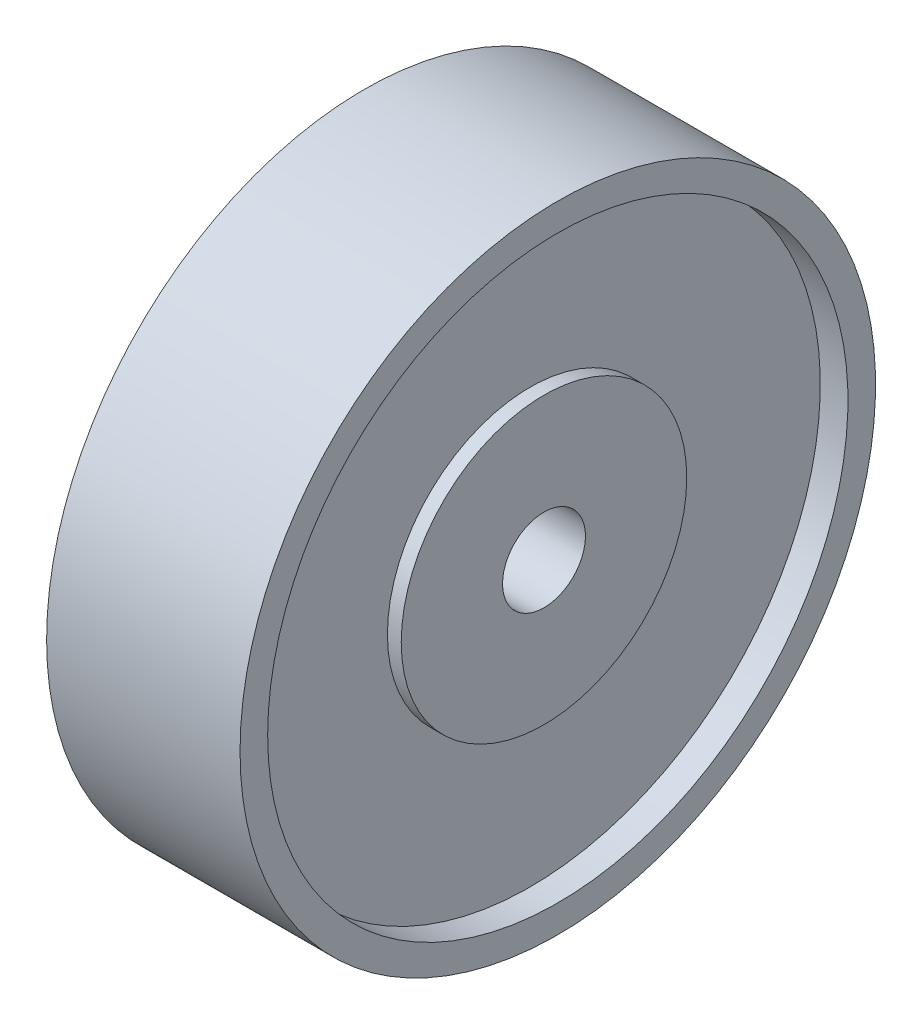
ISO-10303-21;
HEADER;
FILE_DESCRIPTION(('STEP AP214'),'2;1');
FILE_NAME('part.step','',(''),(''),'','','');
FILE_SCHEMA(('AUTOMOTIVE_DESIGN { 1 0 10303 214 1 1 1 1 }'));
ENDSEC;
DATA;
#1=APPLICATION_CONTEXT('core data for automotive mechanical design processes');
#2=APPLICATION_PROTOCOL_DEFINITION('international standard','automotive_design',2000,#1);
#3=PRODUCT_CONTEXT('',#1,'mechanical');
#4=PRODUCT('Part','Part','',(#3));
#5=PRODUCT_RELATED_PRODUCT_CATEGORY('part','',(#4));
#6=PRODUCT_DEFINITION_FORMATION('','',#4);
#7=PRODUCT_DEFINITION_CONTEXT('part definition',#1,'design');
#8=PRODUCT_DEFINITION('design','',#6,#7);
#9=PRODUCT_DEFINITION_SHAPE('','',#8);
#10=(LENGTH_UNIT() NAMED_UNIT(*) SI_UNIT(.MILLI.,.METRE.));
#11=(NAMED_UNIT(*) PLANE_ANGLE_UNIT() SI_UNIT($,.RADIAN.));
#12=(NAMED_UNIT(*) SI_UNIT($,.STERADIAN.) SOLID_ANGLE_UNIT());
#13=UNCERTAINTY_MEASURE_WITH_UNIT(LENGTH_MEASURE(1.E-05),#10,'distance_accuracy_value','');
#14=(GEOMETRIC_REPRESENTATION_CONTEXT(3) GLOBAL_UNCERTAINTY_ASSIGNED_CONTEXT((#13)) GLOBAL_UNIT_ASSIGNED_CONTEXT((#10,
#11,#12)) REPRESENTATION_CONTEXT('',''));
#15=CARTESIAN_POINT('',(0.,0.,0.));
#16=DIRECTION('',(0.,0.,1.));
#17=DIRECTION('',(1.,0.,0.));
#18=AXIS2_PLACEMENT_3D('',#15,#16,#17);
#19=CARTESIAN_POINT('',(0.,0.,0.));
#20=DIRECTION('',(-1.,0.,0.));
#21=DIRECTION('',(0.,0.,1.));
#22=AXIS2_PLACEMENT_3D('',#19,#20,#21);
#23=CYLINDRICAL_SURFACE('',#22,15.);
#24=CARTESIAN_POINT('',(-30.,0.,0.));
#25=DIRECTION('',(-1.,0.,0.));
#26=DIRECTION('',(0.,0.,1.));
#27=AXIS2_PLACEMENT_3D('',#24,#25,#26);
#28=CIRCLE('',#27,15.);
#29=CARTESIAN_POINT('',(-30.,0.,15.));
#30=VERTEX_POINT('',#29);
#31=EDGE_CURVE('E92',#30,#30,#28,.T.);
#32=ORIENTED_EDGE('',*,*,#31,.T.);
#33=EDGE_LOOP('',(#32));
#34=FACE_BOUND('',#33,.T.);
#35=CARTESIAN_POINT('',(30.,0.,0.));
#36=DIRECTION('',(-1.,0.,0.));
#37=DIRECTION('',(0.,0.,1.));
#38=AXIS2_PLACEMENT_3D('',#35,#36,#37);
#39=CIRCLE('',#38,15.);
#40=CARTESIAN_POINT('',(30.,0.,15.));
#41=VERTEX_POINT('',#40);
#42=EDGE_CURVE('E10',#41,#41,#39,.T.);
#43=ORIENTED_EDGE('',*,*,#42,.F.);
#44=EDGE_LOOP('',(#43));
#45=FACE_BOUND('',#44,.T.);
#46=ADVANCED_FACE('F41',(#34,#45),#23,.F.);
#47=CARTESIAN_POINT('',(30.,0.,0.));
#48=DIRECTION('',(1.,0.,0.));
#49=DIRECTION('',(0.,0.,-1.));
#50=AXIS2_PLACEMENT_3D('',#47,#48,#49);
#51=PLANE('',#50);
#52=ORIENTED_EDGE('',*,*,#42,.T.);
#53=EDGE_LOOP('',(#52));
#54=FACE_BOUND('',#53,.T.);
#55=CARTESIAN_POINT('',(30.,0.,0.));
#56=DIRECTION('',(-1.,0.,0.));
#57=DIRECTION('',(0.,0.,1.));
#58=AXIS2_PLACEMENT_3D('',#55,#56,#57);
#59=CIRCLE('',#58,51.6658318187928);
#60=CARTESIAN_POINT('',(30.,0.,51.6658318187928));
#61=VERTEX_POINT('',#60);
#62=EDGE_CURVE('E48',#61,#61,#59,.T.);
#63=ORIENTED_EDGE('',*,*,#62,.F.);
#64=EDGE_LOOP('',(#63));
#65=FACE_BOUND('',#64,.T.);
#66=ADVANCED_FACE('F141',(#54,#65),#51,.T.);
#67=CARTESIAN_POINT('',(0.,0.,0.));
#68=DIRECTION('',(-1.,0.,0.));
#69=DIRECTION('',(0.,0.,1.));
#70=AXIS2_PLACEMENT_3D('',#67,#68,#69);
#71=CYLINDRICAL_SURFACE('',#70,51.6658318187928);
#72=ORIENTED_EDGE('',*,*,#62,.T.);
#73=EDGE_LOOP('',(#72));
#74=FACE_BOUND('',#73,.T.);
#75=CARTESIAN_POINT('',(25.,0.,0.));
#76=DIRECTION('',(-1.,0.,0.));
#77=DIRECTION('',(0.,0.,1.));
#78=AXIS2_PLACEMENT_3D('',#75,#76,#77);
#79=CIRCLE('',#78,51.6658318187928);
#80=CARTESIAN_POINT('',(25.,0.,51.6658318187928));
#81=VERTEX_POINT('',#80);
#82=EDGE_CURVE('E53',#81,#81,#79,.T.);
#83=ORIENTED_EDGE('',*,*,#82,.F.);
#84=EDGE_LOOP('',(#83));
#85=FACE_BOUND('',#84,.T.);
#86=ADVANCED_FACE('F145',(#74,#85),#71,.T.);
#87=CARTESIAN_POINT('',(25.,0.,0.));
#88=DIRECTION('',(1.,0.,0.));
#89=DIRECTION('',(0.,0.,-1.));
#90=AXIS2_PLACEMENT_3D('',#87,#88,#89);
#91=PLANE('',#90);
#92=ORIENTED_EDGE('',*,*,#82,.T.);
#93=EDGE_LOOP('',(#92));
#94=FACE_BOUND('',#93,.T.);
#95=CARTESIAN_POINT('',(25.,0.,0.));
#96=DIRECTION('',(-1.,0.,0.));
#97=DIRECTION('',(0.,0.,1.));
#98=AXIS2_PLACEMENT_3D('',#95,#96,#97);
#99=CIRCLE('',#98,105.);
#100=CARTESIAN_POINT('',(25.,0.,105.));
#101=VERTEX_POINT('',#100);
#102=EDGE_CURVE('E58',#101,#101,#99,.T.);
#103=ORIENTED_EDGE('',*,*,#102,.F.);
#104=EDGE_LOOP('',(#103));
#105=FACE_BOUND('',#104,.T.);
#106=ADVANCED_FACE('F149',(#94,#105),#91,.T.);
#107=CARTESIAN_POINT('',(0.,0.,0.));
#108=DIRECTION('',(-1.,0.,0.));
#109=DIRECTION('',(0.,0.,1.));
#110=AXIS2_PLACEMENT_3D('',#107,#108,#109);
#111=CYLINDRICAL_SURFACE('',#110,105.);
#112=ORIENTED_EDGE('',*,*,#102,.T.);
#113=EDGE_LOOP('',(#112));
#114=FACE_BOUND('',#113,.T.);
#115=CARTESIAN_POINT('',(35.,0.,0.));
#116=DIRECTION('',(-1.,0.,0.));
#117=DIRECTION('',(0.,0.,1.));
#118=AXIS2_PLACEMENT_3D('',#115,#116,#117);
#119=CIRCLE('',#118,105.);
#120=CARTESIAN_POINT('',(35.,0.,105.));
#121=VERTEX_POINT('',#120);
#122=EDGE_CURVE('E64',#121,#121,#119,.T.);
#123=ORIENTED_EDGE('',*,*,#122,.F.);
#124=EDGE_LOOP('',(#123));
#125=FACE_BOUND('',#124,.T.);
#126=ADVANCED_FACE('F137',(#114,#125),#111,.F.);
#127=CARTESIAN_POINT('',(35.,0.,0.));
#128=DIRECTION('',(1.,0.,0.));
#129=DIRECTION('',(0.,0.,-1.));
#130=AXIS2_PLACEMENT_3D('',#127,#128,#129);
#131=PLANE('',#130);
#132=ORIENTED_EDGE('',*,*,#122,.T.);
#133=EDGE_LOOP('',(#132));
#134=FACE_BOUND('',#133,.T.);
#135=CARTESIAN_POINT('',(35.,0.,0.));
#136=DIRECTION('',(-1.,0.,0.));
#137=DIRECTION('',(0.,0.,1.));
#138=AXIS2_PLACEMENT_3D('',#135,#136,#137);
#139=CIRCLE('',#138,115.);
#140=CARTESIAN_POINT('',(35.,0.,115.));
#141=VERTEX_POINT('',#140);
#142=EDGE_CURVE('E68',#141,#141,#139,.T.);
#143=ORIENTED_EDGE('',*,*,#142,.F.);
#144=EDGE_LOOP('',(#143));
#145=FACE_BOUND('',#144,.T.);
#146=ADVANCED_FACE('F131',(#134,#145),#131,.T.);
#147=CARTESIAN_POINT('',(0.,0.,0.));
#148=DIRECTION('',(-1.,0.,0.));
#149=DIRECTION('',(0.,0.,1.));
#150=AXIS2_PLACEMENT_3D('',#147,#148,#149);
#151=CYLINDRICAL_SURFACE('',#150,115.);
#152=ORIENTED_EDGE('',*,*,#142,.T.);
#153=EDGE_LOOP('',(#152));
#154=FACE_BOUND('',#153,.T.);
#155=CARTESIAN_POINT('',(-35.,0.,0.));
#156=DIRECTION('',(-1.,0.,0.));
#157=DIRECTION('',(0.,0.,1.));
#158=AXIS2_PLACEMENT_3D('',#155,#156,#157);
#159=CIRCLE('',#158,115.);
#160=CARTESIAN_POINT('',(-35.,0.,115.));
#161=VERTEX_POINT('',#160);
#162=EDGE_CURVE('E72',#161,#161,#159,.T.);
#163=ORIENTED_EDGE('',*,*,#162,.F.);
#164=EDGE_LOOP('',(#163));
#165=FACE_BOUND('',#164,.T.);
#166=ADVANCED_FACE('F126',(#154,#165),#151,.T.);
#167=CARTESIAN_POINT('',(-35.,0.,0.));
#168=DIRECTION('',(1.,0.,0.));
#169=DIRECTION('',(0.,0.,-1.));
#170=AXIS2_PLACEMENT_3D('',#167,#168,#169);
#171=PLANE('',#170);
#172=CARTESIAN_POINT('',(-35.,0.,0.));
#173=DIRECTION('',(-1.,0.,0.));
#174=DIRECTION('',(0.,0.,1.));
#175=AXIS2_PLACEMENT_3D('',#172,#173,#174);
#176=CIRCLE('',#175,105.);
#177=CARTESIAN_POINT('',(-35.,0.,105.));
#178=VERTEX_POINT('',#177);
#179=EDGE_CURVE('E76',#178,#178,#176,.T.);
#180=ORIENTED_EDGE('',*,*,#179,.F.);
#181=EDGE_LOOP('',(#180));
#182=FACE_BOUND('',#181,.T.);
#183=ORIENTED_EDGE('',*,*,#162,.T.);
#184=EDGE_LOOP('',(#183));
#185=FACE_BOUND('',#184,.T.);
#186=ADVANCED_FACE('F120',(#182,#185),#171,.F.);
#187=CARTESIAN_POINT('',(0.,0.,0.));
#188=DIRECTION('',(-1.,0.,0.));
#189=DIRECTION('',(0.,0.,1.));
#190=AXIS2_PLACEMENT_3D('',#187,#188,#189);
#191=CYLINDRICAL_SURFACE('',#190,105.);
#192=CARTESIAN_POINT('',(-25.,0.,0.));
#193=DIRECTION('',(-1.,0.,0.));
#194=DIRECTION('',(0.,0.,1.));
#195=AXIS2_PLACEMENT_3D('',#192,#193,#194);
#196=CIRCLE('',#195,105.);
#197=CARTESIAN_POINT('',(-25.,0.,105.));
#198=VERTEX_POINT('',#197);
#199=EDGE_CURVE('E80',#198,#198,#196,.T.);
#200=ORIENTED_EDGE('',*,*,#199,.F.);
#201=EDGE_LOOP('',(#200));
#202=FACE_BOUND('',#201,.T.);
#203=ORIENTED_EDGE('',*,*,#179,.T.);
#204=EDGE_LOOP('',(#203));
#205=FACE_BOUND('',#204,.T.);
#206=ADVANCED_FACE('F114',(#202,#205),#191,.F.);
#207=CARTESIAN_POINT('',(-25.,0.,0.));
#208=DIRECTION('',(1.,0.,0.));
#209=DIRECTION('',(0.,0.,-1.));
#210=AXIS2_PLACEMENT_3D('',#207,#208,#209);
#211=PLANE('',#210);
#212=CARTESIAN_POINT('',(-25.,0.,0.));
#213=DIRECTION('',(-1.,0.,0.));
#214=DIRECTION('',(0.,0.,1.));
#215=AXIS2_PLACEMENT_3D('',#212,#213,#214);
#216=CIRCLE('',#215,51.6658318187928);
#217=CARTESIAN_POINT('',(-25.,0.,51.6658318187928));
#218=VERTEX_POINT('',#217);
#219=EDGE_CURVE('E84',#218,#218,#216,.T.);
#220=ORIENTED_EDGE('',*,*,#219,.F.);
#221=EDGE_LOOP('',(#220));
#222=FACE_BOUND('',#221,.T.);
#223=ORIENTED_EDGE('',*,*,#199,.T.);
#224=EDGE_LOOP('',(#223));
#225=FACE_BOUND('',#224,.T.);
#226=ADVANCED_FACE('F108',(#222,#225),#211,.F.);
#227=CARTESIAN_POINT('',(0.,0.,0.));
#228=DIRECTION('',(-1.,0.,0.));
#229=DIRECTION('',(0.,0.,1.));
#230=AXIS2_PLACEMENT_3D('',#227,#228,#229);
#231=CYLINDRICAL_SURFACE('',#230,51.6658318187928);
#232=CARTESIAN_POINT('',(-30.,0.,0.));
#233=DIRECTION('',(-1.,0.,0.));
#234=DIRECTION('',(0.,0.,1.));
#235=AXIS2_PLACEMENT_3D('',#232,#233,#234);
#236=CIRCLE('',#235,51.6658318187928);
#237=CARTESIAN_POINT('',(-30.,0.,51.6658318187928));
#238=VERTEX_POINT('',#237);
#239=EDGE_CURVE('E88',#238,#238,#236,.T.);
#240=ORIENTED_EDGE('',*,*,#239,.F.);
#241=EDGE_LOOP('',(#240));
#242=FACE_BOUND('',#241,.T.);
#243=ORIENTED_EDGE('',*,*,#219,.T.);
#244=EDGE_LOOP('',(#243));
#245=FACE_BOUND('',#244,.T.);
#246=ADVANCED_FACE('F102',(#242,#245),#231,.T.);
#247=CARTESIAN_POINT('',(-30.,0.,0.));
#248=DIRECTION('',(1.,0.,0.));
#249=DIRECTION('',(0.,0.,-1.));
#250=AXIS2_PLACEMENT_3D('',#247,#248,#249);
#251=PLANE('',#250);
#252=ORIENTED_EDGE('',*,*,#31,.F.);
#253=EDGE_LOOP('',(#252));
#254=FACE_BOUND('',#253,.T.);
#255=ORIENTED_EDGE('',*,*,#239,.T.);
#256=EDGE_LOOP('',(#255));
#257=FACE_BOUND('',#256,.T.);
#258=ADVANCED_FACE('F99',(#254,#257),#251,.F.);
#259=CLOSED_SHELL('',(#46,#66,#86,#106,#126,#146,#166,#186,#206,#226,#246,#258));
#260=MANIFOLD_SOLID_BREP('B2',#259);
#261=ADVANCED_BREP_SHAPE_REPRESENTATION('',(#18,#260),#14);
#262=SHAPE_DEFINITION_REPRESENTATION(#9,#261);
ENDSEC;
END-ISO-10303-21;
